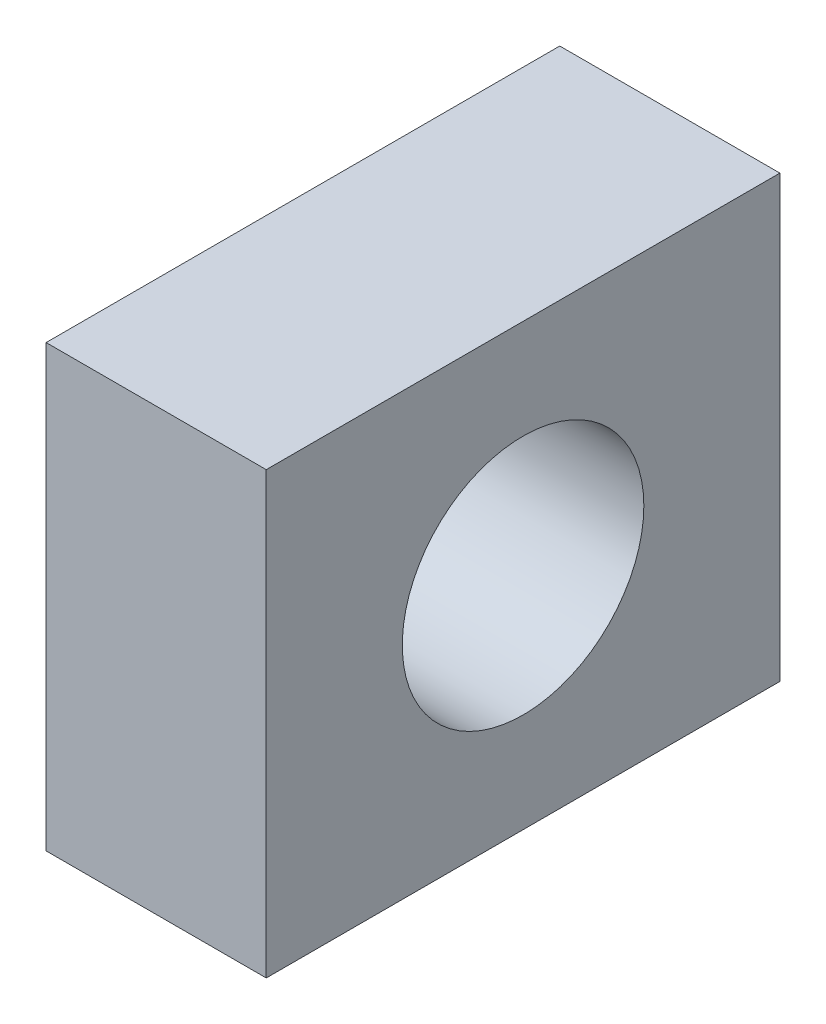
ISO-10303-21;
HEADER;
FILE_DESCRIPTION(('STEP AP214'),'2;1');
FILE_NAME('part.step','',(''),(''),'','','');
FILE_SCHEMA(('AUTOMOTIVE_DESIGN { 1 0 10303 214 1 1 1 1 }'));
ENDSEC;
DATA;
#1=APPLICATION_CONTEXT('core data for automotive mechanical design processes');
#2=APPLICATION_PROTOCOL_DEFINITION('international standard','automotive_design',2000,#1);
#3=PRODUCT_CONTEXT('',#1,'mechanical');
#4=PRODUCT('Part','Part','',(#3));
#5=PRODUCT_RELATED_PRODUCT_CATEGORY('part','',(#4));
#6=PRODUCT_DEFINITION_FORMATION('','',#4);
#7=PRODUCT_DEFINITION_CONTEXT('part definition',#1,'design');
#8=PRODUCT_DEFINITION('design','',#6,#7);
#9=PRODUCT_DEFINITION_SHAPE('','',#8);
#10=(LENGTH_UNIT() NAMED_UNIT(*) SI_UNIT(.MILLI.,.METRE.));
#11=(NAMED_UNIT(*) PLANE_ANGLE_UNIT() SI_UNIT($,.RADIAN.));
#12=(NAMED_UNIT(*) SI_UNIT($,.STERADIAN.) SOLID_ANGLE_UNIT());
#13=UNCERTAINTY_MEASURE_WITH_UNIT(LENGTH_MEASURE(1.E-05),#10,'distance_accuracy_value','');
#14=(GEOMETRIC_REPRESENTATION_CONTEXT(3) GLOBAL_UNCERTAINTY_ASSIGNED_CONTEXT((#13)) GLOBAL_UNIT_ASSIGNED_CONTEXT((#10,
#11,#12)) REPRESENTATION_CONTEXT('',''));
#15=CARTESIAN_POINT('',(0.,0.,0.));
#16=DIRECTION('',(0.,0.,1.));
#17=DIRECTION('',(1.,0.,0.));
#18=AXIS2_PLACEMENT_3D('',#15,#16,#17);
#19=CARTESIAN_POINT('',(25.,15.,-17.5));
#20=DIRECTION('',(0.,0.,1.));
#21=DIRECTION('',(0.,-1.,0.));
#22=AXIS2_PLACEMENT_3D('',#19,#20,#21);
#23=PLANE('',#22);
#24=DIRECTION('',(0.,1.,0.));
#25=VECTOR('',#24,1.);
#26=CARTESIAN_POINT('',(15.,15.,-17.5));
#27=LINE('',#26,#25);
#28=CARTESIAN_POINT('',(15.,-15.,-17.5));
#29=VERTEX_POINT('',#28);
#30=CARTESIAN_POINT('',(15.,15.,-17.5));
#31=VERTEX_POINT('',#30);
#32=EDGE_CURVE('E79',#29,#31,#27,.T.);
#33=ORIENTED_EDGE('',*,*,#32,.F.);
#34=DIRECTION('',(-1.,0.,0.));
#35=VECTOR('',#34,1.);
#36=CARTESIAN_POINT('',(25.,-15.,-17.5));
#37=LINE('',#36,#35);
#38=CARTESIAN_POINT('',(0.,-15.,-17.5));
#39=VERTEX_POINT('',#38);
#40=EDGE_CURVE('E63',#29,#39,#37,.T.);
#41=ORIENTED_EDGE('',*,*,#40,.T.);
#42=DIRECTION('',(0.,1.,0.));
#43=VECTOR('',#42,1.);
#44=CARTESIAN_POINT('',(0.,15.,-17.5));
#45=LINE('',#44,#43);
#46=CARTESIAN_POINT('',(0.,15.,-17.5));
#47=VERTEX_POINT('',#46);
#48=EDGE_CURVE('E96',#39,#47,#45,.T.);
#49=ORIENTED_EDGE('',*,*,#48,.T.);
#50=DIRECTION('',(-1.,0.,0.));
#51=VECTOR('',#50,1.);
#52=CARTESIAN_POINT('',(25.,15.,-17.5));
#53=LINE('',#52,#51);
#54=EDGE_CURVE('E11',#31,#47,#53,.T.);
#55=ORIENTED_EDGE('',*,*,#54,.F.);
#56=EDGE_LOOP('',(#33,#41,#49,#55));
#57=FACE_BOUND('',#56,.T.);
#58=ADVANCED_FACE('F38',(#57),#23,.F.);
#59=CARTESIAN_POINT('',(25.,15.,17.5));
#60=DIRECTION('',(0.,-1.,0.));
#61=DIRECTION('',(0.,0.,-1.));
#62=AXIS2_PLACEMENT_3D('',#59,#60,#61);
#63=PLANE('',#62);
#64=DIRECTION('',(0.,0.,1.));
#65=VECTOR('',#64,1.);
#66=CARTESIAN_POINT('',(15.,15.,17.5));
#67=LINE('',#66,#65);
#68=CARTESIAN_POINT('',(15.,15.,17.5));
#69=VERTEX_POINT('',#68);
#70=EDGE_CURVE('E83',#31,#69,#67,.T.);
#71=ORIENTED_EDGE('',*,*,#70,.F.);
#72=ORIENTED_EDGE('',*,*,#54,.T.);
#73=DIRECTION('',(0.,0.,1.));
#74=VECTOR('',#73,1.);
#75=CARTESIAN_POINT('',(0.,15.,17.5));
#76=LINE('',#75,#74);
#77=CARTESIAN_POINT('',(0.,15.,17.5));
#78=VERTEX_POINT('',#77);
#79=EDGE_CURVE('E100',#47,#78,#76,.T.);
#80=ORIENTED_EDGE('',*,*,#79,.T.);
#81=DIRECTION('',(-1.,0.,0.));
#82=VECTOR('',#81,1.);
#83=CARTESIAN_POINT('',(25.,15.,17.5));
#84=LINE('',#83,#82);
#85=EDGE_CURVE('E47',#69,#78,#84,.T.);
#86=ORIENTED_EDGE('',*,*,#85,.F.);
#87=EDGE_LOOP('',(#71,#72,#80,#86));
#88=FACE_BOUND('',#87,.T.);
#89=ADVANCED_FACE('F90',(#88),#63,.F.);
#90=CARTESIAN_POINT('',(25.,15.,17.5));
#91=DIRECTION('',(0.,0.,-1.));
#92=DIRECTION('',(-1.,0.,0.));
#93=AXIS2_PLACEMENT_3D('',#90,#91,#92);
#94=PLANE('',#93);
#95=DIRECTION('',(0.,-1.,0.));
#96=VECTOR('',#95,1.);
#97=CARTESIAN_POINT('',(15.,15.,17.5));
#98=LINE('',#97,#96);
#99=CARTESIAN_POINT('',(15.,-15.,17.5));
#100=VERTEX_POINT('',#99);
#101=EDGE_CURVE('E55',#69,#100,#98,.T.);
#102=ORIENTED_EDGE('',*,*,#101,.F.);
#103=ORIENTED_EDGE('',*,*,#85,.T.);
#104=DIRECTION('',(0.,-1.,0.));
#105=VECTOR('',#104,1.);
#106=CARTESIAN_POINT('',(0.,15.,17.5));
#107=LINE('',#106,#105);
#108=CARTESIAN_POINT('',(0.,-15.,17.5));
#109=VERTEX_POINT('',#108);
#110=EDGE_CURVE('E105',#78,#109,#107,.T.);
#111=ORIENTED_EDGE('',*,*,#110,.T.);
#112=DIRECTION('',(-1.,0.,0.));
#113=VECTOR('',#112,1.);
#114=CARTESIAN_POINT('',(25.,-15.,17.5));
#115=LINE('',#114,#113);
#116=EDGE_CURVE('E119',#100,#109,#115,.T.);
#117=ORIENTED_EDGE('',*,*,#116,.F.);
#118=EDGE_LOOP('',(#102,#103,#111,#117));
#119=FACE_BOUND('',#118,.T.);
#120=ADVANCED_FACE('F124',(#119),#94,.F.);
#121=CARTESIAN_POINT('',(25.,-15.,17.5));
#122=DIRECTION('',(0.,1.,0.));
#123=DIRECTION('',(0.,0.,1.));
#124=AXIS2_PLACEMENT_3D('',#121,#122,#123);
#125=PLANE('',#124);
#126=DIRECTION('',(0.,0.,-1.));
#127=VECTOR('',#126,1.);
#128=CARTESIAN_POINT('',(15.,-15.,17.5));
#129=LINE('',#128,#127);
#130=EDGE_CURVE('E84',#100,#29,#129,.T.);
#131=ORIENTED_EDGE('',*,*,#130,.F.);
#132=ORIENTED_EDGE('',*,*,#116,.T.);
#133=DIRECTION('',(0.,0.,-1.));
#134=VECTOR('',#133,1.);
#135=CARTESIAN_POINT('',(0.,-15.,17.5));
#136=LINE('',#135,#134);
#137=EDGE_CURVE('E114',#109,#39,#136,.T.);
#138=ORIENTED_EDGE('',*,*,#137,.T.);
#139=ORIENTED_EDGE('',*,*,#40,.F.);
#140=EDGE_LOOP('',(#131,#132,#138,#139));
#141=FACE_BOUND('',#140,.T.);
#142=ADVANCED_FACE('F129',(#141),#125,.F.);
#143=CARTESIAN_POINT('',(-26.,0.,0.));
#144=DIRECTION('',(1.,0.,0.));
#145=DIRECTION('',(0.,0.,-1.));
#146=AXIS2_PLACEMENT_3D('',#143,#144,#145);
#147=CYLINDRICAL_SURFACE('',#146,8.23);
#148=CARTESIAN_POINT('',(0.,0.,0.));
#149=DIRECTION('',(1.,0.,0.));
#150=DIRECTION('',(0.,0.,-1.));
#151=AXIS2_PLACEMENT_3D('',#148,#149,#150);
#152=CIRCLE('',#151,8.23);
#153=CARTESIAN_POINT('',(0.,0.,-8.23));
#154=VERTEX_POINT('',#153);
#155=EDGE_CURVE('E101',#154,#154,#152,.T.);
#156=ORIENTED_EDGE('',*,*,#155,.F.);
#157=EDGE_LOOP('',(#156));
#158=FACE_BOUND('',#157,.T.);
#159=CARTESIAN_POINT('',(15.,0.,0.));
#160=DIRECTION('',(1.,0.,0.));
#161=DIRECTION('',(0.,0.,-1.));
#162=AXIS2_PLACEMENT_3D('',#159,#160,#161);
#163=CIRCLE('',#162,8.23);
#164=CARTESIAN_POINT('',(15.,0.,-8.23));
#165=VERTEX_POINT('',#164);
#166=EDGE_CURVE('E41',#165,#165,#163,.F.);
#167=ORIENTED_EDGE('',*,*,#166,.F.);
#168=EDGE_LOOP('',(#167));
#169=FACE_BOUND('',#168,.T.);
#170=ADVANCED_FACE('F136',(#158,#169),#147,.F.);
#171=CARTESIAN_POINT('',(0.,0.,0.));
#172=DIRECTION('',(1.,0.,0.));
#173=DIRECTION('',(0.,0.,-1.));
#174=AXIS2_PLACEMENT_3D('',#171,#172,#173);
#175=PLANE('',#174);
#176=ORIENTED_EDGE('',*,*,#155,.T.);
#177=EDGE_LOOP('',(#176));
#178=FACE_BOUND('',#177,.T.);
#179=ORIENTED_EDGE('',*,*,#48,.F.);
#180=ORIENTED_EDGE('',*,*,#137,.F.);
#181=ORIENTED_EDGE('',*,*,#110,.F.);
#182=ORIENTED_EDGE('',*,*,#79,.F.);
#183=EDGE_LOOP('',(#179,#180,#181,#182));
#184=FACE_BOUND('',#183,.T.);
#185=ADVANCED_FACE('F127',(#178,#184),#175,.F.);
#186=CARTESIAN_POINT('',(15.,0.,0.));
#187=DIRECTION('',(1.,0.,0.));
#188=DIRECTION('',(0.,0.,-1.));
#189=AXIS2_PLACEMENT_3D('',#186,#187,#188);
#190=PLANE('',#189);
#191=ORIENTED_EDGE('',*,*,#32,.T.);
#192=ORIENTED_EDGE('',*,*,#70,.T.);
#193=ORIENTED_EDGE('',*,*,#101,.T.);
#194=ORIENTED_EDGE('',*,*,#130,.T.);
#195=EDGE_LOOP('',(#191,#192,#193,#194));
#196=FACE_BOUND('',#195,.T.);
#197=ORIENTED_EDGE('',*,*,#166,.T.);
#198=EDGE_LOOP('',(#197));
#199=FACE_BOUND('',#198,.T.);
#200=ADVANCED_FACE('F81',(#196,#199),#190,.T.);
#201=CLOSED_SHELL('',(#58,#89,#120,#142,#170,#185,#200));
#202=MANIFOLD_SOLID_BREP('B2',#201);
#203=ADVANCED_BREP_SHAPE_REPRESENTATION('',(#18,#202),#14);
#204=SHAPE_DEFINITION_REPRESENTATION(#9,#203);
ENDSEC;
END-ISO-10303-21;
